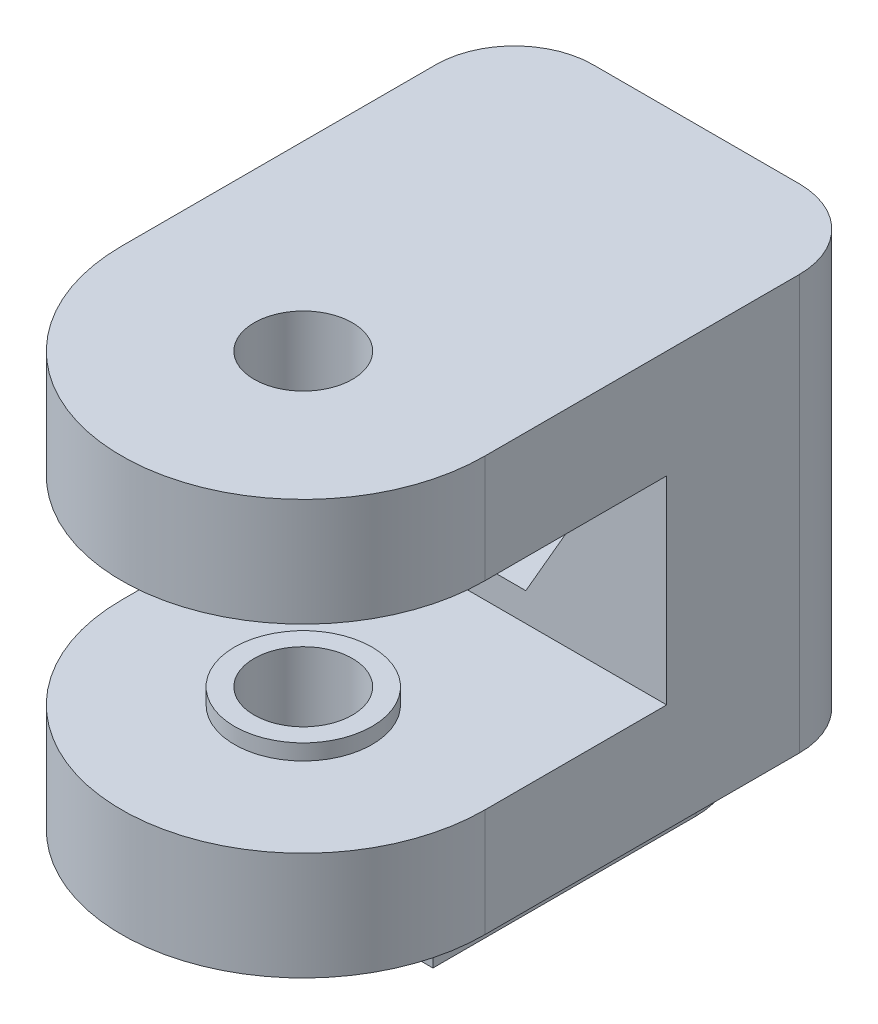
ISO-10303-21;
HEADER;
FILE_DESCRIPTION(('STEP AP214'),'2;1');
FILE_NAME('part.step','',(''),(''),'','','');
FILE_SCHEMA(('AUTOMOTIVE_DESIGN { 1 0 10303 214 1 1 1 1 }'));
ENDSEC;
DATA;
#1=APPLICATION_CONTEXT('core data for automotive mechanical design processes');
#2=APPLICATION_PROTOCOL_DEFINITION('international standard','automotive_design',2000,#1);
#3=PRODUCT_CONTEXT('',#1,'mechanical');
#4=PRODUCT('Part','Part','',(#3));
#5=PRODUCT_RELATED_PRODUCT_CATEGORY('part','',(#4));
#6=PRODUCT_DEFINITION_FORMATION('','',#4);
#7=PRODUCT_DEFINITION_CONTEXT('part definition',#1,'design');
#8=PRODUCT_DEFINITION('design','',#6,#7);
#9=PRODUCT_DEFINITION_SHAPE('','',#8);
#10=(LENGTH_UNIT() NAMED_UNIT(*) SI_UNIT(.MILLI.,.METRE.));
#11=(NAMED_UNIT(*) PLANE_ANGLE_UNIT() SI_UNIT($,.RADIAN.));
#12=(NAMED_UNIT(*) SI_UNIT($,.STERADIAN.) SOLID_ANGLE_UNIT());
#13=UNCERTAINTY_MEASURE_WITH_UNIT(LENGTH_MEASURE(1.E-05),#10,'distance_accuracy_value','');
#14=(GEOMETRIC_REPRESENTATION_CONTEXT(3) GLOBAL_UNCERTAINTY_ASSIGNED_CONTEXT((#13)) GLOBAL_UNIT_ASSIGNED_CONTEXT((#10,
#11,#12)) REPRESENTATION_CONTEXT('',''));
#15=CARTESIAN_POINT('',(0.,0.,0.));
#16=DIRECTION('',(0.,0.,1.));
#17=DIRECTION('',(1.,0.,0.));
#18=AXIS2_PLACEMENT_3D('',#15,#16,#17);
#19=CARTESIAN_POINT('',(-9.25,5.5,9.25));
#20=DIRECTION('',(0.,-1.,0.));
#21=DIRECTION('',(0.,0.,-1.));
#22=AXIS2_PLACEMENT_3D('',#19,#20,#21);
#23=PLANE('',#22);
#24=DIRECTION('',(0.,0.,-1.));
#25=VECTOR('',#24,1.);
#26=CARTESIAN_POINT('',(9.25,5.5,9.25));
#27=LINE('',#26,#25);
#28=CARTESIAN_POINT('',(9.25,5.5,0.));
#29=VERTEX_POINT('',#28);
#30=CARTESIAN_POINT('',(9.25,5.5,-9.25));
#31=VERTEX_POINT('',#30);
#32=EDGE_CURVE('E316',#29,#31,#27,.T.);
#33=ORIENTED_EDGE('',*,*,#32,.T.);
#34=DIRECTION('',(1.,0.,0.));
#35=VECTOR('',#34,1.);
#36=CARTESIAN_POINT('',(-9.25,5.5,-9.25));
#37=LINE('',#36,#35);
#38=CARTESIAN_POINT('',(-9.25,5.5,-9.25));
#39=VERTEX_POINT('',#38);
#40=EDGE_CURVE('E327',#39,#31,#37,.T.);
#41=ORIENTED_EDGE('',*,*,#40,.F.);
#42=DIRECTION('',(0.,0.,-1.));
#43=VECTOR('',#42,1.);
#44=CARTESIAN_POINT('',(-9.25,5.5,9.25));
#45=LINE('',#44,#43);
#46=CARTESIAN_POINT('',(-9.25,5.5,0.));
#47=VERTEX_POINT('',#46);
#48=EDGE_CURVE('E317',#47,#39,#45,.T.);
#49=ORIENTED_EDGE('',*,*,#48,.F.);
#50=CARTESIAN_POINT('',(0.,5.5,0.));
#51=DIRECTION('',(0.,-1.,0.));
#52=DIRECTION('',(0.,0.,-1.));
#53=AXIS2_PLACEMENT_3D('',#50,#51,#52);
#54=CIRCLE('',#53,9.25);
#55=EDGE_CURVE('E336',#29,#47,#54,.T.);
#56=ORIENTED_EDGE('',*,*,#55,.F.);
#57=EDGE_LOOP('',(#33,#41,#49,#56));
#58=FACE_BOUND('',#57,.T.);
#59=CARTESIAN_POINT('',(0.,5.5,0.));
#60=DIRECTION('',(0.,-1.,0.));
#61=DIRECTION('',(0.,0.,-1.));
#62=AXIS2_PLACEMENT_3D('',#59,#60,#61);
#63=CIRCLE('',#62,3.5);
#64=CARTESIAN_POINT('',(0.,5.5,-3.5));
#65=VERTEX_POINT('',#64);
#66=EDGE_CURVE('E377',#65,#65,#63,.F.);
#67=ORIENTED_EDGE('',*,*,#66,.F.);
#68=EDGE_LOOP('',(#67));
#69=FACE_BOUND('',#68,.T.);
#70=ADVANCED_FACE('F41',(#58,#69),#23,.F.);
#71=CARTESIAN_POINT('',(0.,0.,0.));
#72=DIRECTION('',(0.,1.,0.));
#73=DIRECTION('',(0.,0.,1.));
#74=AXIS2_PLACEMENT_3D('',#71,#72,#73);
#75=PLANE('',#74);
#76=CARTESIAN_POINT('',(0.,0.,0.));
#77=DIRECTION('',(0.,1.,0.));
#78=DIRECTION('',(0.,0.,1.));
#79=AXIS2_PLACEMENT_3D('',#76,#77,#78);
#80=CIRCLE('',#79,2.5);
#81=CARTESIAN_POINT('',(0.,0.,2.5));
#82=VERTEX_POINT('',#81);
#83=EDGE_CURVE('E342',#82,#82,#80,.T.);
#84=ORIENTED_EDGE('',*,*,#83,.T.);
#85=EDGE_LOOP('',(#84));
#86=FACE_BOUND('',#85,.T.);
#87=DIRECTION('',(-1.,0.,0.));
#88=VECTOR('',#87,1.);
#89=CARTESIAN_POINT('',(-9.25,0.,-20.));
#90=LINE('',#89,#88);
#91=CARTESIAN_POINT('',(5.25,0.,-20.));
#92=VERTEX_POINT('',#91);
#93=CARTESIAN_POINT('',(0.,0.,-20.));
#94=VERTEX_POINT('',#93);
#95=EDGE_CURVE('E367',#92,#94,#90,.T.);
#96=ORIENTED_EDGE('',*,*,#95,.F.);
#97=CARTESIAN_POINT('',(5.25,0.,-16.));
#98=DIRECTION('',(0.,1.,0.));
#99=DIRECTION('',(0.,0.,1.));
#100=AXIS2_PLACEMENT_3D('',#97,#98,#99);
#101=CIRCLE('',#100,4.);
#102=CARTESIAN_POINT('',(9.25,0.,-16.));
#103=VERTEX_POINT('',#102);
#104=EDGE_CURVE('E387',#92,#103,#101,.F.);
#105=ORIENTED_EDGE('',*,*,#104,.T.);
#106=DIRECTION('',(0.,0.,-1.));
#107=VECTOR('',#106,1.);
#108=CARTESIAN_POINT('',(9.25,0.,-20.));
#109=LINE('',#108,#107);
#110=CARTESIAN_POINT('',(9.25,0.,0.));
#111=VERTEX_POINT('',#110);
#112=EDGE_CURVE('E363',#111,#103,#109,.T.);
#113=ORIENTED_EDGE('',*,*,#112,.F.);
#114=CARTESIAN_POINT('',(0.,0.,0.));
#115=DIRECTION('',(0.,1.,0.));
#116=DIRECTION('',(0.,0.,1.));
#117=AXIS2_PLACEMENT_3D('',#114,#115,#116);
#118=CIRCLE('',#117,9.25);
#119=CARTESIAN_POINT('',(-9.25,0.,0.));
#120=VERTEX_POINT('',#119);
#121=EDGE_CURVE('E346',#120,#111,#118,.T.);
#122=ORIENTED_EDGE('',*,*,#121,.F.);
#123=DIRECTION('',(0.,0.,1.));
#124=VECTOR('',#123,1.);
#125=CARTESIAN_POINT('',(-9.25,0.,0.));
#126=LINE('',#125,#124);
#127=CARTESIAN_POINT('',(-9.25,0.,-16.));
#128=VERTEX_POINT('',#127);
#129=EDGE_CURVE('E353',#128,#120,#126,.T.);
#130=ORIENTED_EDGE('',*,*,#129,.F.);
#131=CARTESIAN_POINT('',(-5.25,0.,-16.));
#132=DIRECTION('',(0.,1.,0.));
#133=DIRECTION('',(0.,0.,1.));
#134=AXIS2_PLACEMENT_3D('',#131,#132,#133);
#135=CIRCLE('',#134,4.);
#136=CARTESIAN_POINT('',(-5.25,0.,-20.));
#137=VERTEX_POINT('',#136);
#138=EDGE_CURVE('E385',#128,#137,#135,.F.);
#139=ORIENTED_EDGE('',*,*,#138,.T.);
#140=EDGE_CURVE('E366',#94,#137,#90,.T.);
#141=ORIENTED_EDGE('',*,*,#140,.F.);
#142=CARTESIAN_POINT('',(0.,0.,-15.9));
#143=DIRECTION('',(0.,-1.,0.));
#144=DIRECTION('',(0.,0.,-1.));
#145=AXIS2_PLACEMENT_3D('',#142,#143,#144);
#146=CIRCLE('',#145,4.1);
#147=CARTESIAN_POINT('',(-4.1,0.,-15.9));
#148=VERTEX_POINT('',#147);
#149=EDGE_CURVE('E290',#148,#94,#146,.T.);
#150=ORIENTED_EDGE('',*,*,#149,.F.);
#151=DIRECTION('',(0.,0.,-1.));
#152=VECTOR('',#151,1.);
#153=CARTESIAN_POINT('',(-4.1,0.,-15.9));
#154=LINE('',#153,#152);
#155=CARTESIAN_POINT('',(-4.1,0.,-2.5));
#156=VERTEX_POINT('',#155);
#157=EDGE_CURVE('E287',#156,#148,#154,.T.);
#158=ORIENTED_EDGE('',*,*,#157,.F.);
#159=DIRECTION('',(-1.,0.,0.));
#160=VECTOR('',#159,1.);
#161=CARTESIAN_POINT('',(-3.24961536185438,0.,-2.5));
#162=LINE('',#161,#160);
#163=CARTESIAN_POINT('',(-3.24961536185438,0.,-2.5));
#164=VERTEX_POINT('',#163);
#165=EDGE_CURVE('E284',#164,#156,#162,.T.);
#166=ORIENTED_EDGE('',*,*,#165,.F.);
#167=CARTESIAN_POINT('',(0.,0.,0.));
#168=DIRECTION('',(0.,1.,0.));
#169=DIRECTION('',(0.,0.,-1.));
#170=AXIS2_PLACEMENT_3D('',#167,#168,#169);
#171=CIRCLE('',#170,4.1);
#172=CARTESIAN_POINT('',(3.24961536185438,0.,-2.5));
#173=VERTEX_POINT('',#172);
#174=EDGE_CURVE('E266',#173,#164,#171,.T.);
#175=ORIENTED_EDGE('',*,*,#174,.F.);
#176=DIRECTION('',(-1.,0.,0.));
#177=VECTOR('',#176,1.);
#178=CARTESIAN_POINT('',(3.24961536185438,0.,-2.5));
#179=LINE('',#178,#177);
#180=CARTESIAN_POINT('',(4.1,0.,-2.5));
#181=VERTEX_POINT('',#180);
#182=EDGE_CURVE('E271',#181,#173,#179,.T.);
#183=ORIENTED_EDGE('',*,*,#182,.F.);
#184=DIRECTION('',(0.,0.,1.));
#185=VECTOR('',#184,1.);
#186=CARTESIAN_POINT('',(4.1,0.,-2.5));
#187=LINE('',#186,#185);
#188=CARTESIAN_POINT('',(4.1,0.,-15.9));
#189=VERTEX_POINT('',#188);
#190=EDGE_CURVE('E293',#189,#181,#187,.T.);
#191=ORIENTED_EDGE('',*,*,#190,.F.);
#192=EDGE_CURVE('E294',#94,#189,#146,.T.);
#193=ORIENTED_EDGE('',*,*,#192,.F.);
#194=EDGE_LOOP('',(#96,#105,#113,#122,#130,#139,#141,#150,#158,#166,#175,#183,#191,#193));
#195=FACE_BOUND('',#194,.T.);
#196=ADVANCED_FACE('F407',(#86,#195),#75,.F.);
#197=CARTESIAN_POINT('',(0.,21.1,0.));
#198=DIRECTION('',(0.,-1.,0.));
#199=DIRECTION('',(0.,0.,-1.));
#200=AXIS2_PLACEMENT_3D('',#197,#198,#199);
#201=CYLINDRICAL_SURFACE('',#200,9.25);
#202=CARTESIAN_POINT('',(0.,15.6,0.));
#203=DIRECTION('',(0.,1.,0.));
#204=DIRECTION('',(0.,0.,1.));
#205=AXIS2_PLACEMENT_3D('',#202,#203,#204);
#206=CIRCLE('',#205,9.25);
#207=CARTESIAN_POINT('',(-9.25,15.6,0.));
#208=VERTEX_POINT('',#207);
#209=CARTESIAN_POINT('',(9.25,15.6,0.));
#210=VERTEX_POINT('',#209);
#211=EDGE_CURVE('E340',#208,#210,#206,.T.);
#212=ORIENTED_EDGE('',*,*,#211,.T.);
#213=DIRECTION('',(0.,-1.,0.));
#214=VECTOR('',#213,1.);
#215=CARTESIAN_POINT('',(9.25,21.1,0.));
#216=LINE('',#215,#214);
#217=CARTESIAN_POINT('',(9.25,21.1,0.));
#218=VERTEX_POINT('',#217);
#219=EDGE_CURVE('E374',#218,#210,#216,.T.);
#220=ORIENTED_EDGE('',*,*,#219,.F.);
#221=CARTESIAN_POINT('',(0.,21.1,0.));
#222=DIRECTION('',(0.,1.,0.));
#223=DIRECTION('',(0.,0.,1.));
#224=AXIS2_PLACEMENT_3D('',#221,#222,#223);
#225=CIRCLE('',#224,9.25);
#226=CARTESIAN_POINT('',(-9.25,21.1,0.));
#227=VERTEX_POINT('',#226);
#228=EDGE_CURVE('E349',#227,#218,#225,.T.);
#229=ORIENTED_EDGE('',*,*,#228,.F.);
#230=DIRECTION('',(0.,-1.,0.));
#231=VECTOR('',#230,1.);
#232=CARTESIAN_POINT('',(-9.25,21.1,0.));
#233=LINE('',#232,#231);
#234=EDGE_CURVE('E370',#227,#208,#233,.T.);
#235=ORIENTED_EDGE('',*,*,#234,.T.);
#236=EDGE_LOOP('',(#212,#220,#229,#235));
#237=FACE_BOUND('',#236,.T.);
#238=ADVANCED_FACE('F444',(#237),#201,.T.);
#239=CARTESIAN_POINT('',(0.,21.1,0.));
#240=DIRECTION('',(0.,-1.,0.));
#241=DIRECTION('',(0.,0.,-1.));
#242=AXIS2_PLACEMENT_3D('',#239,#240,#241);
#243=CYLINDRICAL_SURFACE('',#242,2.5);
#244=CARTESIAN_POINT('',(0.,21.1,0.));
#245=DIRECTION('',(0.,1.,0.));
#246=DIRECTION('',(0.,0.,1.));
#247=AXIS2_PLACEMENT_3D('',#244,#245,#246);
#248=CIRCLE('',#247,2.5);
#249=CARTESIAN_POINT('',(0.,21.1,2.5));
#250=VERTEX_POINT('',#249);
#251=EDGE_CURVE('E343',#250,#250,#248,.T.);
#252=ORIENTED_EDGE('',*,*,#251,.T.);
#253=EDGE_LOOP('',(#252));
#254=FACE_BOUND('',#253,.T.);
#255=CARTESIAN_POINT('',(0.,14.8,0.));
#256=DIRECTION('',(0.,1.,0.));
#257=DIRECTION('',(0.,0.,1.));
#258=AXIS2_PLACEMENT_3D('',#255,#256,#257);
#259=CIRCLE('',#258,2.5);
#260=CARTESIAN_POINT('',(0.,14.8,2.5));
#261=VERTEX_POINT('',#260);
#262=EDGE_CURVE('E244',#261,#261,#259,.T.);
#263=ORIENTED_EDGE('',*,*,#262,.F.);
#264=EDGE_LOOP('',(#263));
#265=FACE_BOUND('',#264,.T.);
#266=ADVANCED_FACE('F456',(#254,#265),#243,.F.);
#267=CARTESIAN_POINT('',(0.,21.1,0.));
#268=DIRECTION('',(0.,1.,0.));
#269=DIRECTION('',(0.,0.,1.));
#270=AXIS2_PLACEMENT_3D('',#267,#268,#269);
#271=PLANE('',#270);
#272=DIRECTION('',(0.,0.,-1.));
#273=VECTOR('',#272,1.);
#274=CARTESIAN_POINT('',(9.25,21.1,-20.));
#275=LINE('',#274,#273);
#276=CARTESIAN_POINT('',(9.25,21.1,-16.));
#277=VERTEX_POINT('',#276);
#278=EDGE_CURVE('E352',#218,#277,#275,.T.);
#279=ORIENTED_EDGE('',*,*,#278,.T.);
#280=CARTESIAN_POINT('',(5.25,21.1,-16.));
#281=DIRECTION('',(0.,1.,0.));
#282=DIRECTION('',(0.,0.,1.));
#283=AXIS2_PLACEMENT_3D('',#280,#281,#282);
#284=CIRCLE('',#283,4.);
#285=CARTESIAN_POINT('',(5.25,21.1,-20.));
#286=VERTEX_POINT('',#285);
#287=EDGE_CURVE('E50',#277,#286,#284,.T.);
#288=ORIENTED_EDGE('',*,*,#287,.T.);
#289=DIRECTION('',(-1.,0.,0.));
#290=VECTOR('',#289,1.);
#291=CARTESIAN_POINT('',(-9.25,21.1,-20.));
#292=LINE('',#291,#290);
#293=CARTESIAN_POINT('',(-5.25,21.1,-20.));
#294=VERTEX_POINT('',#293);
#295=EDGE_CURVE('E356',#286,#294,#292,.T.);
#296=ORIENTED_EDGE('',*,*,#295,.T.);
#297=CARTESIAN_POINT('',(-5.25,21.1,-16.));
#298=DIRECTION('',(0.,1.,0.));
#299=DIRECTION('',(0.,0.,1.));
#300=AXIS2_PLACEMENT_3D('',#297,#298,#299);
#301=CIRCLE('',#300,4.);
#302=CARTESIAN_POINT('',(-9.25,21.1,-16.));
#303=VERTEX_POINT('',#302);
#304=EDGE_CURVE('E65',#294,#303,#301,.T.);
#305=ORIENTED_EDGE('',*,*,#304,.T.);
#306=DIRECTION('',(0.,0.,1.));
#307=VECTOR('',#306,1.);
#308=CARTESIAN_POINT('',(-9.25,21.1,0.));
#309=LINE('',#308,#307);
#310=EDGE_CURVE('E358',#303,#227,#309,.T.);
#311=ORIENTED_EDGE('',*,*,#310,.T.);
#312=ORIENTED_EDGE('',*,*,#228,.T.);
#313=EDGE_LOOP('',(#279,#288,#296,#305,#311,#312));
#314=FACE_BOUND('',#313,.T.);
#315=ORIENTED_EDGE('',*,*,#251,.F.);
#316=EDGE_LOOP('',(#315));
#317=FACE_BOUND('',#316,.T.);
#318=ADVANCED_FACE('F394',(#314,#317),#271,.T.);
#319=EDGE_CURVE('E373',#29,#111,#216,.T.);
#320=ORIENTED_EDGE('',*,*,#319,.F.);
#321=ORIENTED_EDGE('',*,*,#55,.T.);
#322=EDGE_CURVE('E360',#47,#120,#233,.T.);
#323=ORIENTED_EDGE('',*,*,#322,.T.);
#324=ORIENTED_EDGE('',*,*,#121,.T.);
#325=EDGE_LOOP('',(#320,#321,#323,#324));
#326=FACE_BOUND('',#325,.T.);
#327=ADVANCED_FACE('F416',(#326),#201,.T.);
#328=CARTESIAN_POINT('',(9.25,21.1,-20.));
#329=DIRECTION('',(-1.,0.,0.));
#330=DIRECTION('',(0.,0.,1.));
#331=AXIS2_PLACEMENT_3D('',#328,#329,#330);
#332=PLANE('',#331);
#333=ORIENTED_EDGE('',*,*,#112,.T.);
#334=DIRECTION('',(0.,-1.,0.));
#335=VECTOR('',#334,1.);
#336=CARTESIAN_POINT('',(9.25,21.1,-16.));
#337=LINE('',#336,#335);
#338=EDGE_CURVE('E389',#103,#277,#337,.F.);
#339=ORIENTED_EDGE('',*,*,#338,.T.);
#340=ORIENTED_EDGE('',*,*,#278,.F.);
#341=ORIENTED_EDGE('',*,*,#219,.T.);
#342=DIRECTION('',(0.,0.,1.));
#343=VECTOR('',#342,1.);
#344=CARTESIAN_POINT('',(9.25,15.6,9.25));
#345=LINE('',#344,#343);
#346=CARTESIAN_POINT('',(9.25,15.6,-9.25));
#347=VERTEX_POINT('',#346);
#348=EDGE_CURVE('E321',#347,#210,#345,.T.);
#349=ORIENTED_EDGE('',*,*,#348,.F.);
#350=DIRECTION('',(0.,1.,0.));
#351=VECTOR('',#350,1.);
#352=CARTESIAN_POINT('',(9.25,15.6,-9.25));
#353=LINE('',#352,#351);
#354=EDGE_CURVE('E329',#31,#347,#353,.T.);
#355=ORIENTED_EDGE('',*,*,#354,.F.);
#356=ORIENTED_EDGE('',*,*,#32,.F.);
#357=ORIENTED_EDGE('',*,*,#319,.T.);
#358=EDGE_LOOP('',(#333,#339,#340,#341,#349,#355,#356,#357));
#359=FACE_BOUND('',#358,.T.);
#360=ADVANCED_FACE('F411',(#359),#332,.F.);
#361=CARTESIAN_POINT('',(-9.25,21.1,-20.));
#362=DIRECTION('',(0.,0.,1.));
#363=DIRECTION('',(1.,0.,0.));
#364=AXIS2_PLACEMENT_3D('',#361,#362,#363);
#365=PLANE('',#364);
#366=CARTESIAN_POINT('',(0.,10.55,-20.));
#367=DIRECTION('',(0.,0.,1.));
#368=DIRECTION('',(1.,0.,0.));
#369=AXIS2_PLACEMENT_3D('',#366,#367,#368);
#370=CIRCLE('',#369,2.2);
#371=CARTESIAN_POINT('',(2.2,10.55,-20.));
#372=VERTEX_POINT('',#371);
#373=EDGE_CURVE('E45',#372,#372,#370,.T.);
#374=ORIENTED_EDGE('',*,*,#373,.T.);
#375=EDGE_LOOP('',(#374));
#376=FACE_BOUND('',#375,.T.);
#377=ORIENTED_EDGE('',*,*,#295,.F.);
#378=DIRECTION('',(0.,-1.,0.));
#379=VECTOR('',#378,1.);
#380=CARTESIAN_POINT('',(5.25,21.1,-20.));
#381=LINE('',#380,#379);
#382=EDGE_CURVE('E382',#286,#92,#381,.T.);
#383=ORIENTED_EDGE('',*,*,#382,.T.);
#384=ORIENTED_EDGE('',*,*,#95,.T.);
#385=ORIENTED_EDGE('',*,*,#140,.T.);
#386=DIRECTION('',(0.,-1.,0.));
#387=VECTOR('',#386,1.);
#388=CARTESIAN_POINT('',(-5.25,21.1,-20.));
#389=LINE('',#388,#387);
#390=EDGE_CURVE('E380',#137,#294,#389,.F.);
#391=ORIENTED_EDGE('',*,*,#390,.T.);
#392=EDGE_LOOP('',(#377,#383,#384,#385,#391));
#393=FACE_BOUND('',#392,.T.);
#394=ADVANCED_FACE('F400',(#376,#393),#365,.F.);
#395=CARTESIAN_POINT('',(-9.25,21.1,0.));
#396=DIRECTION('',(1.,0.,0.));
#397=DIRECTION('',(0.,0.,-1.));
#398=AXIS2_PLACEMENT_3D('',#395,#396,#397);
#399=PLANE('',#398);
#400=ORIENTED_EDGE('',*,*,#310,.F.);
#401=DIRECTION('',(0.,-1.,0.));
#402=VECTOR('',#401,1.);
#403=CARTESIAN_POINT('',(-9.25,21.1,-16.));
#404=LINE('',#403,#402);
#405=EDGE_CURVE('E11',#303,#128,#404,.T.);
#406=ORIENTED_EDGE('',*,*,#405,.T.);
#407=ORIENTED_EDGE('',*,*,#129,.T.);
#408=ORIENTED_EDGE('',*,*,#322,.F.);
#409=ORIENTED_EDGE('',*,*,#48,.T.);
#410=DIRECTION('',(0.,1.,0.));
#411=VECTOR('',#410,1.);
#412=CARTESIAN_POINT('',(-9.25,15.6,-9.25));
#413=LINE('',#412,#411);
#414=CARTESIAN_POINT('',(-9.25,15.6,-9.25));
#415=VERTEX_POINT('',#414);
#416=EDGE_CURVE('E320',#39,#415,#413,.T.);
#417=ORIENTED_EDGE('',*,*,#416,.T.);
#418=DIRECTION('',(0.,0.,1.));
#419=VECTOR('',#418,1.);
#420=CARTESIAN_POINT('',(-9.25,15.6,9.25));
#421=LINE('',#420,#419);
#422=EDGE_CURVE('E324',#415,#208,#421,.T.);
#423=ORIENTED_EDGE('',*,*,#422,.T.);
#424=ORIENTED_EDGE('',*,*,#234,.F.);
#425=EDGE_LOOP('',(#400,#406,#407,#408,#409,#417,#423,#424));
#426=FACE_BOUND('',#425,.T.);
#427=ADVANCED_FACE('F423',(#426),#399,.F.);
#428=ORIENTED_EDGE('',*,*,#83,.F.);
#429=EDGE_LOOP('',(#428));
#430=FACE_BOUND('',#429,.T.);
#431=CARTESIAN_POINT('',(0.,6.3,0.));
#432=DIRECTION('',(0.,1.,0.));
#433=DIRECTION('',(0.,0.,1.));
#434=AXIS2_PLACEMENT_3D('',#431,#432,#433);
#435=CIRCLE('',#434,2.5);
#436=CARTESIAN_POINT('',(0.,6.3,2.5));
#437=VERTEX_POINT('',#436);
#438=EDGE_CURVE('E258',#437,#437,#435,.T.);
#439=ORIENTED_EDGE('',*,*,#438,.T.);
#440=EDGE_LOOP('',(#439));
#441=FACE_BOUND('',#440,.T.);
#442=ADVANCED_FACE('F452',(#430,#441),#243,.F.);
#443=CARTESIAN_POINT('',(-9.25,15.6,9.25));
#444=DIRECTION('',(0.,1.,0.));
#445=DIRECTION('',(0.,0.,1.));
#446=AXIS2_PLACEMENT_3D('',#443,#444,#445);
#447=PLANE('',#446);
#448=CARTESIAN_POINT('',(0.,15.6,0.));
#449=DIRECTION('',(0.,1.,0.));
#450=DIRECTION('',(0.,0.,1.));
#451=AXIS2_PLACEMENT_3D('',#448,#449,#450);
#452=CIRCLE('',#451,3.5);
#453=CARTESIAN_POINT('',(0.,15.6,3.5));
#454=VERTEX_POINT('',#453);
#455=EDGE_CURVE('E254',#454,#454,#452,.T.);
#456=ORIENTED_EDGE('',*,*,#455,.T.);
#457=EDGE_LOOP('',(#456));
#458=FACE_BOUND('',#457,.T.);
#459=ORIENTED_EDGE('',*,*,#211,.F.);
#460=ORIENTED_EDGE('',*,*,#422,.F.);
#461=DIRECTION('',(1.,0.,0.));
#462=VECTOR('',#461,1.);
#463=CARTESIAN_POINT('',(-9.25,15.6,-9.25));
#464=LINE('',#463,#462);
#465=EDGE_CURVE('E334',#415,#347,#464,.T.);
#466=ORIENTED_EDGE('',*,*,#465,.T.);
#467=ORIENTED_EDGE('',*,*,#348,.T.);
#468=EDGE_LOOP('',(#459,#460,#466,#467));
#469=FACE_BOUND('',#468,.T.);
#470=ADVANCED_FACE('F454',(#458,#469),#447,.F.);
#471=CARTESIAN_POINT('',(-9.25,15.6,-9.25));
#472=DIRECTION('',(0.,0.,-1.));
#473=DIRECTION('',(-1.,0.,0.));
#474=AXIS2_PLACEMENT_3D('',#471,#472,#473);
#475=PLANE('',#474);
#476=DIRECTION('',(0.5,0.866025403784439,0.));
#477=VECTOR('',#476,1.);
#478=CARTESIAN_POINT('',(2.07846096908265,6.94999999999999,-9.25));
#479=LINE('',#478,#477);
#480=CARTESIAN_POINT('',(2.07846096908265,6.95,-9.25));
#481=VERTEX_POINT('',#480);
#482=CARTESIAN_POINT('',(4.1569219381653,10.55,-9.25));
#483=VERTEX_POINT('',#482);
#484=EDGE_CURVE('E232',#481,#483,#479,.T.);
#485=ORIENTED_EDGE('',*,*,#484,.F.);
#486=DIRECTION('',(1.,0.,0.));
#487=VECTOR('',#486,1.);
#488=CARTESIAN_POINT('',(-2.07846096908265,6.95,-9.25));
#489=LINE('',#488,#487);
#490=CARTESIAN_POINT('',(-2.07846096908265,6.95,-9.25));
#491=VERTEX_POINT('',#490);
#492=EDGE_CURVE('E57',#491,#481,#489,.T.);
#493=ORIENTED_EDGE('',*,*,#492,.F.);
#494=DIRECTION('',(0.5,-0.866025403784439,0.));
#495=VECTOR('',#494,1.);
#496=CARTESIAN_POINT('',(-4.15692193816531,10.55,-9.25));
#497=LINE('',#496,#495);
#498=CARTESIAN_POINT('',(-4.15692193816531,10.55,-9.25));
#499=VERTEX_POINT('',#498);
#500=EDGE_CURVE('E216',#499,#491,#497,.T.);
#501=ORIENTED_EDGE('',*,*,#500,.F.);
#502=DIRECTION('',(-0.5,-0.866025403784438,0.));
#503=VECTOR('',#502,1.);
#504=CARTESIAN_POINT('',(-2.07846096908265,14.15,-9.25));
#505=LINE('',#504,#503);
#506=CARTESIAN_POINT('',(-2.07846096908265,14.15,-9.25));
#507=VERTEX_POINT('',#506);
#508=EDGE_CURVE('E219',#507,#499,#505,.T.);
#509=ORIENTED_EDGE('',*,*,#508,.F.);
#510=DIRECTION('',(-1.,0.,0.));
#511=VECTOR('',#510,1.);
#512=CARTESIAN_POINT('',(2.07846096908265,14.15,-9.25));
#513=LINE('',#512,#511);
#514=CARTESIAN_POINT('',(2.07846096908265,14.15,-9.25));
#515=VERTEX_POINT('',#514);
#516=EDGE_CURVE('E237',#515,#507,#513,.T.);
#517=ORIENTED_EDGE('',*,*,#516,.F.);
#518=DIRECTION('',(-0.5,0.866025403784439,0.));
#519=VECTOR('',#518,1.);
#520=CARTESIAN_POINT('',(4.1569219381653,10.55,-9.25));
#521=LINE('',#520,#519);
#522=EDGE_CURVE('E234',#483,#515,#521,.T.);
#523=ORIENTED_EDGE('',*,*,#522,.F.);
#524=EDGE_LOOP('',(#485,#493,#501,#509,#517,#523));
#525=FACE_BOUND('',#524,.T.);
#526=ORIENTED_EDGE('',*,*,#354,.T.);
#527=ORIENTED_EDGE('',*,*,#465,.F.);
#528=ORIENTED_EDGE('',*,*,#416,.F.);
#529=ORIENTED_EDGE('',*,*,#40,.T.);
#530=EDGE_LOOP('',(#526,#527,#528,#529));
#531=FACE_BOUND('',#530,.T.);
#532=ADVANCED_FACE('F450',(#525,#531),#475,.F.);
#533=CARTESIAN_POINT('',(0.,-5.3,0.));
#534=DIRECTION('',(0.,1.,0.));
#535=DIRECTION('',(0.,0.,1.));
#536=AXIS2_PLACEMENT_3D('',#533,#534,#535);
#537=CYLINDRICAL_SURFACE('',#536,4.1);
#538=ORIENTED_EDGE('',*,*,#174,.T.);
#539=DIRECTION('',(0.,1.,0.));
#540=VECTOR('',#539,1.);
#541=CARTESIAN_POINT('',(-3.24961536185438,-5.3,-2.5));
#542=LINE('',#541,#540);
#543=CARTESIAN_POINT('',(-3.24961536185438,-5.3,-2.5));
#544=VERTEX_POINT('',#543);
#545=EDGE_CURVE('E313',#544,#164,#542,.T.);
#546=ORIENTED_EDGE('',*,*,#545,.F.);
#547=CARTESIAN_POINT('',(0.,-5.3,0.));
#548=DIRECTION('',(0.,1.,0.));
#549=DIRECTION('',(0.,0.,-1.));
#550=AXIS2_PLACEMENT_3D('',#547,#548,#549);
#551=CIRCLE('',#550,4.1);
#552=CARTESIAN_POINT('',(3.24961536185438,-5.3,-2.5));
#553=VERTEX_POINT('',#552);
#554=EDGE_CURVE('E267',#553,#544,#551,.T.);
#555=ORIENTED_EDGE('',*,*,#554,.F.);
#556=DIRECTION('',(0.,1.,0.));
#557=VECTOR('',#556,1.);
#558=CARTESIAN_POINT('',(3.24961536185438,-5.3,-2.5));
#559=LINE('',#558,#557);
#560=EDGE_CURVE('E281',#553,#173,#559,.T.);
#561=ORIENTED_EDGE('',*,*,#560,.T.);
#562=EDGE_LOOP('',(#538,#546,#555,#561));
#563=FACE_BOUND('',#562,.T.);
#564=ADVANCED_FACE('F483',(#563),#537,.F.);
#565=CARTESIAN_POINT('',(-3.24961536185438,-5.3,-2.5));
#566=DIRECTION('',(0.,0.,-1.));
#567=DIRECTION('',(-1.,0.,0.));
#568=AXIS2_PLACEMENT_3D('',#565,#566,#567);
#569=PLANE('',#568);
#570=ORIENTED_EDGE('',*,*,#165,.T.);
#571=DIRECTION('',(0.,1.,0.));
#572=VECTOR('',#571,1.);
#573=CARTESIAN_POINT('',(-4.1,-5.3,-2.5));
#574=LINE('',#573,#572);
#575=CARTESIAN_POINT('',(-4.1,-5.3,-2.5));
#576=VERTEX_POINT('',#575);
#577=EDGE_CURVE('E310',#576,#156,#574,.T.);
#578=ORIENTED_EDGE('',*,*,#577,.F.);
#579=DIRECTION('',(-1.,0.,0.));
#580=VECTOR('',#579,1.);
#581=CARTESIAN_POINT('',(-3.24961536185438,-5.3,-2.5));
#582=LINE('',#581,#580);
#583=EDGE_CURVE('E270',#544,#576,#582,.T.);
#584=ORIENTED_EDGE('',*,*,#583,.F.);
#585=ORIENTED_EDGE('',*,*,#545,.T.);
#586=EDGE_LOOP('',(#570,#578,#584,#585));
#587=FACE_BOUND('',#586,.T.);
#588=ADVANCED_FACE('F487',(#587),#569,.F.);
#589=CARTESIAN_POINT('',(-4.1,-5.3,-15.9));
#590=DIRECTION('',(1.,0.,0.));
#591=DIRECTION('',(0.,0.,-1.));
#592=AXIS2_PLACEMENT_3D('',#589,#590,#591);
#593=PLANE('',#592);
#594=ORIENTED_EDGE('',*,*,#157,.T.);
#595=DIRECTION('',(0.,1.,0.));
#596=VECTOR('',#595,1.);
#597=CARTESIAN_POINT('',(-4.1,-5.3,-15.9));
#598=LINE('',#597,#596);
#599=CARTESIAN_POINT('',(-4.1,-5.3,-15.9));
#600=VERTEX_POINT('',#599);
#601=EDGE_CURVE('E307',#600,#148,#598,.T.);
#602=ORIENTED_EDGE('',*,*,#601,.F.);
#603=DIRECTION('',(0.,0.,-1.));
#604=VECTOR('',#603,1.);
#605=CARTESIAN_POINT('',(-4.1,-5.3,-15.9));
#606=LINE('',#605,#604);
#607=EDGE_CURVE('E273',#576,#600,#606,.T.);
#608=ORIENTED_EDGE('',*,*,#607,.F.);
#609=ORIENTED_EDGE('',*,*,#577,.T.);
#610=EDGE_LOOP('',(#594,#602,#608,#609));
#611=FACE_BOUND('',#610,.T.);
#612=ADVANCED_FACE('F549',(#611),#593,.F.);
#613=CARTESIAN_POINT('',(0.,-5.3,-15.9));
#614=DIRECTION('',(0.,1.,0.));
#615=DIRECTION('',(0.,0.,1.));
#616=AXIS2_PLACEMENT_3D('',#613,#614,#615);
#617=CYLINDRICAL_SURFACE('',#616,4.1);
#618=ORIENTED_EDGE('',*,*,#149,.T.);
#619=ORIENTED_EDGE('',*,*,#192,.T.);
#620=DIRECTION('',(0.,1.,0.));
#621=VECTOR('',#620,1.);
#622=CARTESIAN_POINT('',(4.1,-5.3,-15.9));
#623=LINE('',#622,#621);
#624=CARTESIAN_POINT('',(4.1,-5.3,-15.9));
#625=VERTEX_POINT('',#624);
#626=EDGE_CURVE('E304',#625,#189,#623,.T.);
#627=ORIENTED_EDGE('',*,*,#626,.F.);
#628=CARTESIAN_POINT('',(0.,-5.3,-15.9));
#629=DIRECTION('',(0.,-1.,0.));
#630=DIRECTION('',(0.,0.,-1.));
#631=AXIS2_PLACEMENT_3D('',#628,#629,#630);
#632=CIRCLE('',#631,4.1);
#633=EDGE_CURVE('E275',#600,#625,#632,.T.);
#634=ORIENTED_EDGE('',*,*,#633,.F.);
#635=ORIENTED_EDGE('',*,*,#601,.T.);
#636=EDGE_LOOP('',(#618,#619,#627,#634,#635));
#637=FACE_BOUND('',#636,.T.);
#638=ADVANCED_FACE('F545',(#637),#617,.T.);
#639=CARTESIAN_POINT('',(4.1,-5.3,-2.5));
#640=DIRECTION('',(-1.,0.,0.));
#641=DIRECTION('',(0.,0.,1.));
#642=AXIS2_PLACEMENT_3D('',#639,#640,#641);
#643=PLANE('',#642);
#644=ORIENTED_EDGE('',*,*,#190,.T.);
#645=DIRECTION('',(0.,1.,0.));
#646=VECTOR('',#645,1.);
#647=CARTESIAN_POINT('',(4.1,-5.3,-2.5));
#648=LINE('',#647,#646);
#649=CARTESIAN_POINT('',(4.1,-5.3,-2.5));
#650=VERTEX_POINT('',#649);
#651=EDGE_CURVE('E301',#650,#181,#648,.T.);
#652=ORIENTED_EDGE('',*,*,#651,.F.);
#653=DIRECTION('',(0.,0.,1.));
#654=VECTOR('',#653,1.);
#655=CARTESIAN_POINT('',(4.1,-5.3,-2.5));
#656=LINE('',#655,#654);
#657=EDGE_CURVE('E277',#625,#650,#656,.T.);
#658=ORIENTED_EDGE('',*,*,#657,.F.);
#659=ORIENTED_EDGE('',*,*,#626,.T.);
#660=EDGE_LOOP('',(#644,#652,#658,#659));
#661=FACE_BOUND('',#660,.T.);
#662=ADVANCED_FACE('F541',(#661),#643,.F.);
#663=CARTESIAN_POINT('',(3.24961536185438,-5.3,-2.5));
#664=DIRECTION('',(0.,0.,-1.));
#665=DIRECTION('',(-1.,0.,0.));
#666=AXIS2_PLACEMENT_3D('',#663,#664,#665);
#667=PLANE('',#666);
#668=ORIENTED_EDGE('',*,*,#182,.T.);
#669=ORIENTED_EDGE('',*,*,#560,.F.);
#670=DIRECTION('',(-1.,0.,0.));
#671=VECTOR('',#670,1.);
#672=CARTESIAN_POINT('',(3.24961536185438,-5.3,-2.5));
#673=LINE('',#672,#671);
#674=EDGE_CURVE('E279',#650,#553,#673,.T.);
#675=ORIENTED_EDGE('',*,*,#674,.F.);
#676=ORIENTED_EDGE('',*,*,#651,.T.);
#677=EDGE_LOOP('',(#668,#669,#675,#676));
#678=FACE_BOUND('',#677,.T.);
#679=ADVANCED_FACE('F537',(#678),#667,.F.);
#680=CARTESIAN_POINT('',(0.,-5.3,0.));
#681=DIRECTION('',(0.,-1.,0.));
#682=DIRECTION('',(0.,0.,-1.));
#683=AXIS2_PLACEMENT_3D('',#680,#681,#682);
#684=PLANE('',#683);
#685=ORIENTED_EDGE('',*,*,#554,.T.);
#686=ORIENTED_EDGE('',*,*,#583,.T.);
#687=ORIENTED_EDGE('',*,*,#607,.T.);
#688=ORIENTED_EDGE('',*,*,#633,.T.);
#689=ORIENTED_EDGE('',*,*,#657,.T.);
#690=ORIENTED_EDGE('',*,*,#674,.T.);
#691=EDGE_LOOP('',(#685,#686,#687,#688,#689,#690));
#692=FACE_BOUND('',#691,.T.);
#693=ADVANCED_FACE('F531',(#692),#684,.T.);
#694=CARTESIAN_POINT('',(0.,6.3,0.));
#695=DIRECTION('',(0.,1.,0.));
#696=DIRECTION('',(0.,0.,1.));
#697=AXIS2_PLACEMENT_3D('',#694,#695,#696);
#698=PLANE('',#697);
#699=CARTESIAN_POINT('',(0.,6.3,0.));
#700=DIRECTION('',(0.,1.,0.));
#701=DIRECTION('',(0.,0.,1.));
#702=AXIS2_PLACEMENT_3D('',#699,#700,#701);
#703=CIRCLE('',#702,3.5);
#704=CARTESIAN_POINT('',(0.,6.3,3.5));
#705=VERTEX_POINT('',#704);
#706=EDGE_CURVE('E263',#705,#705,#703,.T.);
#707=ORIENTED_EDGE('',*,*,#706,.T.);
#708=EDGE_LOOP('',(#707));
#709=FACE_BOUND('',#708,.T.);
#710=ORIENTED_EDGE('',*,*,#438,.F.);
#711=EDGE_LOOP('',(#710));
#712=FACE_BOUND('',#711,.T.);
#713=ADVANCED_FACE('F528',(#709,#712),#698,.T.);
#714=CARTESIAN_POINT('',(0.,6.3,0.));
#715=DIRECTION('',(0.,-1.,0.));
#716=DIRECTION('',(0.,0.,-1.));
#717=AXIS2_PLACEMENT_3D('',#714,#715,#716);
#718=CYLINDRICAL_SURFACE('',#717,3.5);
#719=ORIENTED_EDGE('',*,*,#706,.F.);
#720=EDGE_LOOP('',(#719));
#721=FACE_BOUND('',#720,.T.);
#722=ORIENTED_EDGE('',*,*,#66,.T.);
#723=EDGE_LOOP('',(#722));
#724=FACE_BOUND('',#723,.T.);
#725=ADVANCED_FACE('F526',(#721,#724),#718,.T.);
#726=CARTESIAN_POINT('',(0.,14.8,0.));
#727=DIRECTION('',(0.,1.,0.));
#728=DIRECTION('',(0.,0.,1.));
#729=AXIS2_PLACEMENT_3D('',#726,#727,#728);
#730=CYLINDRICAL_SURFACE('',#729,3.5);
#731=CARTESIAN_POINT('',(0.,14.8,0.));
#732=DIRECTION('',(0.,1.,0.));
#733=DIRECTION('',(0.,0.,1.));
#734=AXIS2_PLACEMENT_3D('',#731,#732,#733);
#735=CIRCLE('',#734,3.5);
#736=CARTESIAN_POINT('',(0.,14.8,3.5));
#737=VERTEX_POINT('',#736);
#738=EDGE_CURVE('E255',#737,#737,#735,.T.);
#739=ORIENTED_EDGE('',*,*,#738,.T.);
#740=EDGE_LOOP('',(#739));
#741=FACE_BOUND('',#740,.T.);
#742=ORIENTED_EDGE('',*,*,#455,.F.);
#743=EDGE_LOOP('',(#742));
#744=FACE_BOUND('',#743,.T.);
#745=ADVANCED_FACE('F522',(#741,#744),#730,.T.);
#746=CARTESIAN_POINT('',(0.,14.8,0.));
#747=DIRECTION('',(0.,-1.,0.));
#748=DIRECTION('',(0.,0.,1.));
#749=AXIS2_PLACEMENT_3D('',#746,#747,#748);
#750=PLANE('',#749);
#751=ORIENTED_EDGE('',*,*,#262,.T.);
#752=EDGE_LOOP('',(#751));
#753=FACE_BOUND('',#752,.T.);
#754=ORIENTED_EDGE('',*,*,#738,.F.);
#755=EDGE_LOOP('',(#754));
#756=FACE_BOUND('',#755,.T.);
#757=ADVANCED_FACE('F435',(#753,#756),#750,.T.);
#758=CARTESIAN_POINT('',(5.25,21.1,-16.));
#759=DIRECTION('',(0.,-1.,0.));
#760=DIRECTION('',(0.,0.,-1.));
#761=AXIS2_PLACEMENT_3D('',#758,#759,#760);
#762=CYLINDRICAL_SURFACE('',#761,4.);
#763=ORIENTED_EDGE('',*,*,#287,.F.);
#764=ORIENTED_EDGE('',*,*,#338,.F.);
#765=ORIENTED_EDGE('',*,*,#104,.F.);
#766=ORIENTED_EDGE('',*,*,#382,.F.);
#767=EDGE_LOOP('',(#763,#764,#765,#766));
#768=FACE_BOUND('',#767,.T.);
#769=ADVANCED_FACE('F404',(#768),#762,.T.);
#770=CARTESIAN_POINT('',(-5.25,21.1,-16.));
#771=DIRECTION('',(0.,-1.,0.));
#772=DIRECTION('',(0.,0.,-1.));
#773=AXIS2_PLACEMENT_3D('',#770,#771,#772);
#774=CYLINDRICAL_SURFACE('',#773,4.);
#775=ORIENTED_EDGE('',*,*,#304,.F.);
#776=ORIENTED_EDGE('',*,*,#390,.F.);
#777=ORIENTED_EDGE('',*,*,#138,.F.);
#778=ORIENTED_EDGE('',*,*,#405,.F.);
#779=EDGE_LOOP('',(#775,#776,#777,#778));
#780=FACE_BOUND('',#779,.T.);
#781=ADVANCED_FACE('F43',(#780),#774,.T.);
#782=CARTESIAN_POINT('',(-2.07846096908265,6.95,-16.25));
#783=DIRECTION('',(0.,-1.,0.));
#784=DIRECTION('',(1.,0.,0.));
#785=AXIS2_PLACEMENT_3D('',#782,#783,#784);
#786=PLANE('',#785);
#787=ORIENTED_EDGE('',*,*,#492,.T.);
#788=DIRECTION('',(0.,0.,1.));
#789=VECTOR('',#788,1.);
#790=CARTESIAN_POINT('',(2.07846096908265,6.94999999999999,-16.25));
#791=LINE('',#790,#789);
#792=CARTESIAN_POINT('',(2.07846096908265,6.94999999999999,-16.25));
#793=VERTEX_POINT('',#792);
#794=EDGE_CURVE('E193',#793,#481,#791,.T.);
#795=ORIENTED_EDGE('',*,*,#794,.F.);
#796=DIRECTION('',(1.,0.,0.));
#797=VECTOR('',#796,1.);
#798=CARTESIAN_POINT('',(-2.07846096908265,6.95,-16.25));
#799=LINE('',#798,#797);
#800=CARTESIAN_POINT('',(-2.07846096908265,6.95,-16.25));
#801=VERTEX_POINT('',#800);
#802=EDGE_CURVE('E197',#801,#793,#799,.T.);
#803=ORIENTED_EDGE('',*,*,#802,.F.);
#804=DIRECTION('',(0.,0.,1.));
#805=VECTOR('',#804,1.);
#806=CARTESIAN_POINT('',(-2.07846096908265,6.95,-16.25));
#807=LINE('',#806,#805);
#808=EDGE_CURVE('E242',#801,#491,#807,.T.);
#809=ORIENTED_EDGE('',*,*,#808,.T.);
#810=EDGE_LOOP('',(#787,#795,#803,#809));
#811=FACE_BOUND('',#810,.T.);
#812=ADVANCED_FACE('F195',(#811),#786,.F.);
#813=CARTESIAN_POINT('',(-4.15692193816531,10.55,-16.25));
#814=DIRECTION('',(-0.866025403784439,-0.5,0.));
#815=DIRECTION('',(0.5,-0.866025403784439,0.));
#816=AXIS2_PLACEMENT_3D('',#813,#814,#815);
#817=PLANE('',#816);
#818=ORIENTED_EDGE('',*,*,#500,.T.);
#819=ORIENTED_EDGE('',*,*,#808,.F.);
#820=DIRECTION('',(0.5,-0.866025403784439,0.));
#821=VECTOR('',#820,1.);
#822=CARTESIAN_POINT('',(-4.15692193816531,10.55,-16.25));
#823=LINE('',#822,#821);
#824=CARTESIAN_POINT('',(-4.15692193816531,10.55,-16.25));
#825=VERTEX_POINT('',#824);
#826=EDGE_CURVE('E203',#825,#801,#823,.T.);
#827=ORIENTED_EDGE('',*,*,#826,.F.);
#828=DIRECTION('',(0.,0.,1.));
#829=VECTOR('',#828,1.);
#830=CARTESIAN_POINT('',(-4.15692193816531,10.55,-16.25));
#831=LINE('',#830,#829);
#832=EDGE_CURVE('E245',#825,#499,#831,.T.);
#833=ORIENTED_EDGE('',*,*,#832,.T.);
#834=EDGE_LOOP('',(#818,#819,#827,#833));
#835=FACE_BOUND('',#834,.T.);
#836=ADVANCED_FACE('F433',(#835),#817,.F.);
#837=CARTESIAN_POINT('',(-2.07846096908265,14.15,-16.25));
#838=DIRECTION('',(-0.866025403784438,0.5,0.));
#839=DIRECTION('',(-0.5,-0.866025403784439,0.));
#840=AXIS2_PLACEMENT_3D('',#837,#838,#839);
#841=PLANE('',#840);
#842=ORIENTED_EDGE('',*,*,#508,.T.);
#843=ORIENTED_EDGE('',*,*,#832,.F.);
#844=DIRECTION('',(-0.5,-0.866025403784438,0.));
#845=VECTOR('',#844,1.);
#846=CARTESIAN_POINT('',(-2.07846096908265,14.15,-16.25));
#847=LINE('',#846,#845);
#848=CARTESIAN_POINT('',(-2.07846096908265,14.15,-16.25));
#849=VERTEX_POINT('',#848);
#850=EDGE_CURVE('E228',#849,#825,#847,.T.);
#851=ORIENTED_EDGE('',*,*,#850,.F.);
#852=DIRECTION('',(0.,0.,1.));
#853=VECTOR('',#852,1.);
#854=CARTESIAN_POINT('',(-2.07846096908265,14.15,-16.25));
#855=LINE('',#854,#853);
#856=EDGE_CURVE('E247',#849,#507,#855,.T.);
#857=ORIENTED_EDGE('',*,*,#856,.T.);
#858=EDGE_LOOP('',(#842,#843,#851,#857));
#859=FACE_BOUND('',#858,.T.);
#860=ADVANCED_FACE('F503',(#859),#841,.F.);
#861=CARTESIAN_POINT('',(2.07846096908265,14.15,-16.25));
#862=DIRECTION('',(0.,1.,0.));
#863=DIRECTION('',(0.,0.,1.));
#864=AXIS2_PLACEMENT_3D('',#861,#862,#863);
#865=PLANE('',#864);
#866=ORIENTED_EDGE('',*,*,#516,.T.);
#867=ORIENTED_EDGE('',*,*,#856,.F.);
#868=DIRECTION('',(-1.,0.,0.));
#869=VECTOR('',#868,1.);
#870=CARTESIAN_POINT('',(2.07846096908265,14.15,-16.25));
#871=LINE('',#870,#869);
#872=CARTESIAN_POINT('',(2.07846096908265,14.15,-16.25));
#873=VERTEX_POINT('',#872);
#874=EDGE_CURVE('E225',#873,#849,#871,.T.);
#875=ORIENTED_EDGE('',*,*,#874,.F.);
#876=DIRECTION('',(0.,0.,1.));
#877=VECTOR('',#876,1.);
#878=CARTESIAN_POINT('',(2.07846096908265,14.15,-16.25));
#879=LINE('',#878,#877);
#880=EDGE_CURVE('E249',#873,#515,#879,.T.);
#881=ORIENTED_EDGE('',*,*,#880,.T.);
#882=EDGE_LOOP('',(#866,#867,#875,#881));
#883=FACE_BOUND('',#882,.T.);
#884=ADVANCED_FACE('F501',(#883),#865,.F.);
#885=CARTESIAN_POINT('',(4.1569219381653,10.55,-16.25));
#886=DIRECTION('',(0.866025403784439,0.5,0.));
#887=DIRECTION('',(-0.5,0.866025403784439,0.));
#888=AXIS2_PLACEMENT_3D('',#885,#886,#887);
#889=PLANE('',#888);
#890=ORIENTED_EDGE('',*,*,#522,.T.);
#891=ORIENTED_EDGE('',*,*,#880,.F.);
#892=DIRECTION('',(-0.5,0.866025403784439,0.));
#893=VECTOR('',#892,1.);
#894=CARTESIAN_POINT('',(4.1569219381653,10.55,-16.25));
#895=LINE('',#894,#893);
#896=CARTESIAN_POINT('',(4.1569219381653,10.55,-16.25));
#897=VERTEX_POINT('',#896);
#898=EDGE_CURVE('E211',#897,#873,#895,.T.);
#899=ORIENTED_EDGE('',*,*,#898,.F.);
#900=DIRECTION('',(0.,0.,1.));
#901=VECTOR('',#900,1.);
#902=CARTESIAN_POINT('',(4.1569219381653,10.55,-16.25));
#903=LINE('',#902,#901);
#904=EDGE_CURVE('E202',#897,#483,#903,.T.);
#905=ORIENTED_EDGE('',*,*,#904,.T.);
#906=EDGE_LOOP('',(#890,#891,#899,#905));
#907=FACE_BOUND('',#906,.T.);
#908=ADVANCED_FACE('F497',(#907),#889,.F.);
#909=CARTESIAN_POINT('',(2.07846096908265,6.94999999999999,-16.25));
#910=DIRECTION('',(0.866025403784439,-0.5,0.));
#911=DIRECTION('',(0.5,0.866025403784439,0.));
#912=AXIS2_PLACEMENT_3D('',#909,#910,#911);
#913=PLANE('',#912);
#914=ORIENTED_EDGE('',*,*,#484,.T.);
#915=ORIENTED_EDGE('',*,*,#904,.F.);
#916=DIRECTION('',(0.5,0.866025403784439,0.));
#917=VECTOR('',#916,1.);
#918=CARTESIAN_POINT('',(2.07846096908265,6.94999999999999,-16.25));
#919=LINE('',#918,#917);
#920=EDGE_CURVE('E206',#793,#897,#919,.T.);
#921=ORIENTED_EDGE('',*,*,#920,.F.);
#922=ORIENTED_EDGE('',*,*,#794,.T.);
#923=EDGE_LOOP('',(#914,#915,#921,#922));
#924=FACE_BOUND('',#923,.T.);
#925=ADVANCED_FACE('F207',(#924),#913,.F.);
#926=CARTESIAN_POINT('',(0.,0.,-16.25));
#927=DIRECTION('',(0.,0.,1.));
#928=DIRECTION('',(1.,0.,0.));
#929=AXIS2_PLACEMENT_3D('',#926,#927,#928);
#930=PLANE('',#929);
#931=CARTESIAN_POINT('',(0.,10.55,-16.25));
#932=DIRECTION('',(0.,0.,1.));
#933=DIRECTION('',(1.,0.,0.));
#934=AXIS2_PLACEMENT_3D('',#931,#932,#933);
#935=CIRCLE('',#934,2.2);
#936=CARTESIAN_POINT('',(2.2,10.55,-16.25));
#937=VERTEX_POINT('',#936);
#938=EDGE_CURVE('E222',#937,#937,#935,.T.);
#939=ORIENTED_EDGE('',*,*,#938,.F.);
#940=EDGE_LOOP('',(#939));
#941=FACE_BOUND('',#940,.T.);
#942=ORIENTED_EDGE('',*,*,#802,.T.);
#943=ORIENTED_EDGE('',*,*,#920,.T.);
#944=ORIENTED_EDGE('',*,*,#898,.T.);
#945=ORIENTED_EDGE('',*,*,#874,.T.);
#946=ORIENTED_EDGE('',*,*,#850,.T.);
#947=ORIENTED_EDGE('',*,*,#826,.T.);
#948=EDGE_LOOP('',(#942,#943,#944,#945,#946,#947));
#949=FACE_BOUND('',#948,.T.);
#950=ADVANCED_FACE('F213',(#941,#949),#930,.T.);
#951=CARTESIAN_POINT('',(0.,10.55,-23.25));
#952=DIRECTION('',(0.,0.,1.));
#953=DIRECTION('',(1.,0.,0.));
#954=AXIS2_PLACEMENT_3D('',#951,#952,#953);
#955=CYLINDRICAL_SURFACE('',#954,2.2);
#956=ORIENTED_EDGE('',*,*,#938,.T.);
#957=EDGE_LOOP('',(#956));
#958=FACE_BOUND('',#957,.T.);
#959=ORIENTED_EDGE('',*,*,#373,.F.);
#960=EDGE_LOOP('',(#959));
#961=FACE_BOUND('',#960,.T.);
#962=ADVANCED_FACE('F696',(#958,#961),#955,.F.);
#963=CLOSED_SHELL('',(#70,#196,#238,#266,#318,#327,#360,#394,#427,#442,#470,#532,#564,#588,#612,
#638,#662,#679,#693,#713,#725,#745,#757,#769,#781,#812,#836,#860,#884,#908,#925,#950,#962));
#964=MANIFOLD_SOLID_BREP('B2',#963);
#965=ADVANCED_BREP_SHAPE_REPRESENTATION('',(#18,#964),#14);
#966=SHAPE_DEFINITION_REPRESENTATION(#9,#965);
ENDSEC;
END-ISO-10303-21;
